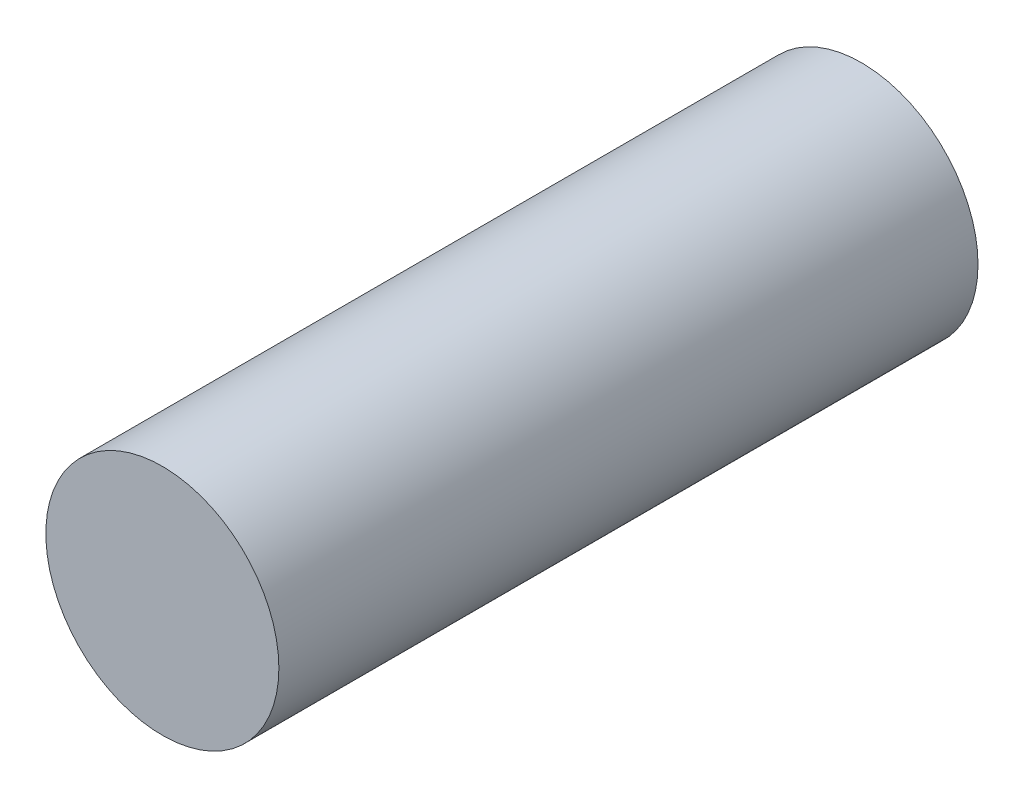
ISO-10303-21;
HEADER;
FILE_DESCRIPTION(('STEP AP214'),'2;1');
FILE_NAME('part.step','',(''),(''),'','','');
FILE_SCHEMA(('AUTOMOTIVE_DESIGN { 1 0 10303 214 1 1 1 1 }'));
ENDSEC;
DATA;
#1=APPLICATION_CONTEXT('core data for automotive mechanical design processes');
#2=APPLICATION_PROTOCOL_DEFINITION('international standard','automotive_design',2000,#1);
#3=PRODUCT_CONTEXT('',#1,'mechanical');
#4=PRODUCT('Part','Part','',(#3));
#5=PRODUCT_RELATED_PRODUCT_CATEGORY('part','',(#4));
#6=PRODUCT_DEFINITION_FORMATION('','',#4);
#7=PRODUCT_DEFINITION_CONTEXT('part definition',#1,'design');
#8=PRODUCT_DEFINITION('design','',#6,#7);
#9=PRODUCT_DEFINITION_SHAPE('','',#8);
#10=(LENGTH_UNIT() NAMED_UNIT(*) SI_UNIT(.MILLI.,.METRE.));
#11=(NAMED_UNIT(*) PLANE_ANGLE_UNIT() SI_UNIT($,.RADIAN.));
#12=(NAMED_UNIT(*) SI_UNIT($,.STERADIAN.) SOLID_ANGLE_UNIT());
#13=UNCERTAINTY_MEASURE_WITH_UNIT(LENGTH_MEASURE(1.E-05),#10,'distance_accuracy_value','');
#14=(GEOMETRIC_REPRESENTATION_CONTEXT(3) GLOBAL_UNCERTAINTY_ASSIGNED_CONTEXT((#13)) GLOBAL_UNIT_ASSIGNED_CONTEXT((#10,
#11,#12)) REPRESENTATION_CONTEXT('',''));
#15=CARTESIAN_POINT('',(0.,0.,0.));
#16=DIRECTION('',(0.,0.,1.));
#17=DIRECTION('',(1.,0.,0.));
#18=AXIS2_PLACEMENT_3D('',#15,#16,#17);
#19=CARTESIAN_POINT('',(0.,0.,24.));
#20=DIRECTION('',(0.,0.,-1.));
#21=DIRECTION('',(-1.,0.,0.));
#22=AXIS2_PLACEMENT_3D('',#19,#20,#21);
#23=CYLINDRICAL_SURFACE('',#22,4.);
#24=CARTESIAN_POINT('',(0.,0.,24.));
#25=DIRECTION('',(0.,0.,1.));
#26=DIRECTION('',(1.,0.,0.));
#27=AXIS2_PLACEMENT_3D('',#24,#25,#26);
#28=CIRCLE('',#27,4.);
#29=CARTESIAN_POINT('',(4.,0.,24.));
#30=VERTEX_POINT('',#29);
#31=EDGE_CURVE('E10',#30,#30,#28,.T.);
#32=ORIENTED_EDGE('',*,*,#31,.F.);
#33=EDGE_LOOP('',(#32));
#34=FACE_BOUND('',#33,.T.);
#35=CARTESIAN_POINT('',(0.,0.,0.));
#36=DIRECTION('',(0.,0.,1.));
#37=DIRECTION('',(1.,0.,0.));
#38=AXIS2_PLACEMENT_3D('',#35,#36,#37);
#39=CIRCLE('',#38,4.);
#40=CARTESIAN_POINT('',(4.,0.,0.));
#41=VERTEX_POINT('',#40);
#42=EDGE_CURVE('E41',#41,#41,#39,.T.);
#43=ORIENTED_EDGE('',*,*,#42,.T.);
#44=EDGE_LOOP('',(#43));
#45=FACE_BOUND('',#44,.T.);
#46=ADVANCED_FACE('F38',(#34,#45),#23,.T.);
#47=CARTESIAN_POINT('',(0.,0.,24.));
#48=DIRECTION('',(0.,0.,1.));
#49=DIRECTION('',(1.,0.,0.));
#50=AXIS2_PLACEMENT_3D('',#47,#48,#49);
#51=PLANE('',#50);
#52=ORIENTED_EDGE('',*,*,#31,.T.);
#53=EDGE_LOOP('',(#52));
#54=FACE_BOUND('',#53,.T.);
#55=ADVANCED_FACE('F53',(#54),#51,.T.);
#56=CARTESIAN_POINT('',(0.,0.,0.));
#57=DIRECTION('',(0.,0.,1.));
#58=DIRECTION('',(1.,0.,0.));
#59=AXIS2_PLACEMENT_3D('',#56,#57,#58);
#60=PLANE('',#59);
#61=ORIENTED_EDGE('',*,*,#42,.F.);
#62=EDGE_LOOP('',(#61));
#63=FACE_BOUND('',#62,.T.);
#64=ADVANCED_FACE('F51',(#63),#60,.F.);
#65=CLOSED_SHELL('',(#46,#55,#64));
#66=MANIFOLD_SOLID_BREP('B2',#65);
#67=ADVANCED_BREP_SHAPE_REPRESENTATION('',(#18,#66),#14);
#68=SHAPE_DEFINITION_REPRESENTATION(#9,#67);
ENDSEC;
END-ISO-10303-21;
